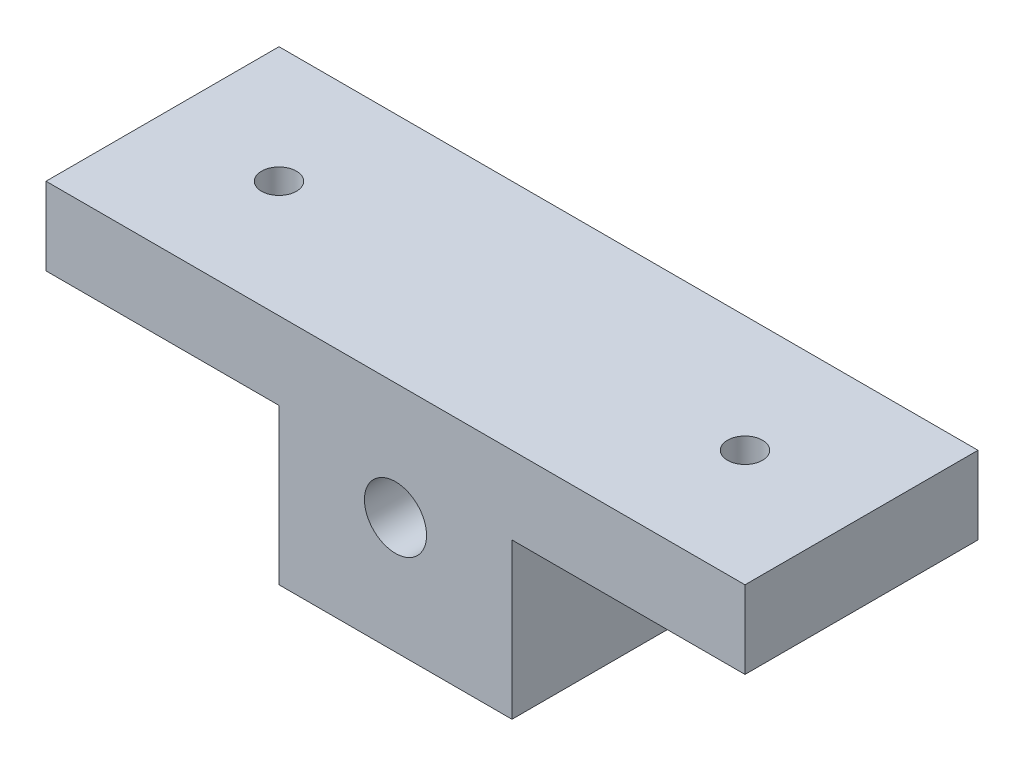
ISO-10303-21;
HEADER;
FILE_DESCRIPTION(('STEP AP214'),'2;1');
FILE_NAME('part.step','',(''),(''),'','','');
FILE_SCHEMA(('AUTOMOTIVE_DESIGN { 1 0 10303 214 1 1 1 1 }'));
ENDSEC;
DATA;
#1=APPLICATION_CONTEXT('core data for automotive mechanical design processes');
#2=APPLICATION_PROTOCOL_DEFINITION('international standard','automotive_design',2000,#1);
#3=PRODUCT_CONTEXT('',#1,'mechanical');
#4=PRODUCT('Part','Part','',(#3));
#5=PRODUCT_RELATED_PRODUCT_CATEGORY('part','',(#4));
#6=PRODUCT_DEFINITION_FORMATION('','',#4);
#7=PRODUCT_DEFINITION_CONTEXT('part definition',#1,'design');
#8=PRODUCT_DEFINITION('design','',#6,#7);
#9=PRODUCT_DEFINITION_SHAPE('','',#8);
#10=(LENGTH_UNIT() NAMED_UNIT(*) SI_UNIT(.MILLI.,.METRE.));
#11=(NAMED_UNIT(*) PLANE_ANGLE_UNIT() SI_UNIT($,.RADIAN.));
#12=(NAMED_UNIT(*) SI_UNIT($,.STERADIAN.) SOLID_ANGLE_UNIT());
#13=UNCERTAINTY_MEASURE_WITH_UNIT(LENGTH_MEASURE(1.E-05),#10,'distance_accuracy_value','');
#14=(GEOMETRIC_REPRESENTATION_CONTEXT(3) GLOBAL_UNCERTAINTY_ASSIGNED_CONTEXT((#13)) GLOBAL_UNIT_ASSIGNED_CONTEXT((#10,
#11,#12)) REPRESENTATION_CONTEXT('',''));
#15=CARTESIAN_POINT('',(0.,0.,0.));
#16=DIRECTION('',(0.,0.,1.));
#17=DIRECTION('',(1.,0.,0.));
#18=AXIS2_PLACEMENT_3D('',#15,#16,#17);
#19=CARTESIAN_POINT('',(-15.,15.,30.));
#20=DIRECTION('',(1.,0.,0.));
#21=DIRECTION('',(0.,1.,0.));
#22=AXIS2_PLACEMENT_3D('',#19,#20,#21);
#23=PLANE('',#22);
#24=DIRECTION('',(0.,0.,1.));
#25=VECTOR('',#24,1.);
#26=CARTESIAN_POINT('',(-15.,5.,0.));
#27=LINE('',#26,#25);
#28=CARTESIAN_POINT('',(-15.,5.,0.));
#29=VERTEX_POINT('',#28);
#30=CARTESIAN_POINT('',(-15.,5.,30.));
#31=VERTEX_POINT('',#30);
#32=EDGE_CURVE('E59',#29,#31,#27,.T.);
#33=ORIENTED_EDGE('',*,*,#32,.F.);
#34=DIRECTION('',(0.,-1.,0.));
#35=VECTOR('',#34,1.);
#36=CARTESIAN_POINT('',(-15.,15.,0.));
#37=LINE('',#36,#35);
#38=CARTESIAN_POINT('',(-15.,-15.,0.));
#39=VERTEX_POINT('',#38);
#40=EDGE_CURVE('E135',#29,#39,#37,.T.);
#41=ORIENTED_EDGE('',*,*,#40,.T.);
#42=DIRECTION('',(0.,0.,-1.));
#43=VECTOR('',#42,1.);
#44=CARTESIAN_POINT('',(-15.,-15.,30.));
#45=LINE('',#44,#43);
#46=CARTESIAN_POINT('',(-15.,-15.,30.));
#47=VERTEX_POINT('',#46);
#48=EDGE_CURVE('E11',#47,#39,#45,.T.);
#49=ORIENTED_EDGE('',*,*,#48,.F.);
#50=DIRECTION('',(0.,-1.,0.));
#51=VECTOR('',#50,1.);
#52=CARTESIAN_POINT('',(-15.,15.,30.));
#53=LINE('',#52,#51);
#54=EDGE_CURVE('E183',#31,#47,#53,.T.);
#55=ORIENTED_EDGE('',*,*,#54,.F.);
#56=EDGE_LOOP('',(#33,#41,#49,#55));
#57=FACE_BOUND('',#56,.T.);
#58=ADVANCED_FACE('F43',(#57),#23,.F.);
#59=CARTESIAN_POINT('',(15.,15.,30.));
#60=DIRECTION('',(-1.,0.,0.));
#61=DIRECTION('',(0.,-1.,0.));
#62=AXIS2_PLACEMENT_3D('',#59,#60,#61);
#63=PLANE('',#62);
#64=DIRECTION('',(0.,0.,-1.));
#65=VECTOR('',#64,1.);
#66=CARTESIAN_POINT('',(15.,5.,30.));
#67=LINE('',#66,#65);
#68=CARTESIAN_POINT('',(15.,5.,30.));
#69=VERTEX_POINT('',#68);
#70=CARTESIAN_POINT('',(15.,5.,0.));
#71=VERTEX_POINT('',#70);
#72=EDGE_CURVE('E67',#69,#71,#67,.T.);
#73=ORIENTED_EDGE('',*,*,#72,.F.);
#74=DIRECTION('',(0.,1.,0.));
#75=VECTOR('',#74,1.);
#76=CARTESIAN_POINT('',(15.,15.,30.));
#77=LINE('',#76,#75);
#78=CARTESIAN_POINT('',(15.,-15.,30.));
#79=VERTEX_POINT('',#78);
#80=EDGE_CURVE('E176',#79,#69,#77,.T.);
#81=ORIENTED_EDGE('',*,*,#80,.F.);
#82=DIRECTION('',(0.,0.,-1.));
#83=VECTOR('',#82,1.);
#84=CARTESIAN_POINT('',(15.,-15.,30.));
#85=LINE('',#84,#83);
#86=CARTESIAN_POINT('',(15.,-15.,0.));
#87=VERTEX_POINT('',#86);
#88=EDGE_CURVE('E52',#79,#87,#85,.T.);
#89=ORIENTED_EDGE('',*,*,#88,.T.);
#90=DIRECTION('',(0.,1.,0.));
#91=VECTOR('',#90,1.);
#92=CARTESIAN_POINT('',(15.,15.,0.));
#93=LINE('',#92,#91);
#94=EDGE_CURVE('E172',#87,#71,#93,.T.);
#95=ORIENTED_EDGE('',*,*,#94,.T.);
#96=EDGE_LOOP('',(#73,#81,#89,#95));
#97=FACE_BOUND('',#96,.T.);
#98=ADVANCED_FACE('F45',(#97),#63,.F.);
#99=CARTESIAN_POINT('',(-15.,15.,30.));
#100=DIRECTION('',(0.,-1.,0.));
#101=DIRECTION('',(0.,0.,-1.));
#102=AXIS2_PLACEMENT_3D('',#99,#100,#101);
#103=PLANE('',#102);
#104=CARTESIAN_POINT('',(30.,15.,15.));
#105=DIRECTION('',(0.,-1.,0.));
#106=DIRECTION('',(0.,0.,-1.));
#107=AXIS2_PLACEMENT_3D('',#104,#105,#106);
#108=CIRCLE('',#107,2.25);
#109=CARTESIAN_POINT('',(30.,15.,12.75));
#110=VERTEX_POINT('',#109);
#111=EDGE_CURVE('E234',#110,#110,#108,.T.);
#112=ORIENTED_EDGE('',*,*,#111,.T.);
#113=EDGE_LOOP('',(#112));
#114=FACE_BOUND('',#113,.T.);
#115=CARTESIAN_POINT('',(-30.,15.,15.));
#116=DIRECTION('',(0.,-1.,0.));
#117=DIRECTION('',(0.,0.,-1.));
#118=AXIS2_PLACEMENT_3D('',#115,#116,#117);
#119=CIRCLE('',#118,2.25);
#120=CARTESIAN_POINT('',(-30.,15.,12.75));
#121=VERTEX_POINT('',#120);
#122=EDGE_CURVE('E213',#121,#121,#119,.T.);
#123=ORIENTED_EDGE('',*,*,#122,.T.);
#124=EDGE_LOOP('',(#123));
#125=FACE_BOUND('',#124,.T.);
#126=DIRECTION('',(-1.,0.,0.));
#127=VECTOR('',#126,1.);
#128=CARTESIAN_POINT('',(-15.,15.,0.));
#129=LINE('',#128,#127);
#130=CARTESIAN_POINT('',(45.,15.,0.));
#131=VERTEX_POINT('',#130);
#132=CARTESIAN_POINT('',(-45.,15.,0.));
#133=VERTEX_POINT('',#132);
#134=EDGE_CURVE('E191',#131,#133,#129,.T.);
#135=ORIENTED_EDGE('',*,*,#134,.T.);
#136=DIRECTION('',(0.,0.,-1.));
#137=VECTOR('',#136,1.);
#138=CARTESIAN_POINT('',(-45.,15.,0.));
#139=LINE('',#138,#137);
#140=CARTESIAN_POINT('',(-45.,15.,30.));
#141=VERTEX_POINT('',#140);
#142=EDGE_CURVE('E128',#141,#133,#139,.T.);
#143=ORIENTED_EDGE('',*,*,#142,.F.);
#144=DIRECTION('',(-1.,0.,0.));
#145=VECTOR('',#144,1.);
#146=CARTESIAN_POINT('',(-15.,15.,30.));
#147=LINE('',#146,#145);
#148=CARTESIAN_POINT('',(45.,15.,30.));
#149=VERTEX_POINT('',#148);
#150=EDGE_CURVE('E179',#149,#141,#147,.T.);
#151=ORIENTED_EDGE('',*,*,#150,.F.);
#152=DIRECTION('',(0.,0.,1.));
#153=VECTOR('',#152,1.);
#154=CARTESIAN_POINT('',(45.,15.,30.));
#155=LINE('',#154,#153);
#156=EDGE_CURVE('E155',#131,#149,#155,.T.);
#157=ORIENTED_EDGE('',*,*,#156,.F.);
#158=EDGE_LOOP('',(#135,#143,#151,#157));
#159=FACE_BOUND('',#158,.T.);
#160=ADVANCED_FACE('F270',(#114,#125,#159),#103,.F.);
#161=CARTESIAN_POINT('',(-15.,-15.,30.));
#162=DIRECTION('',(0.,1.,0.));
#163=DIRECTION('',(0.,0.,1.));
#164=AXIS2_PLACEMENT_3D('',#161,#162,#163);
#165=PLANE('',#164);
#166=DIRECTION('',(1.,0.,0.));
#167=VECTOR('',#166,1.);
#168=CARTESIAN_POINT('',(-15.,-15.,0.));
#169=LINE('',#168,#167);
#170=EDGE_CURVE('E180',#39,#87,#169,.T.);
#171=ORIENTED_EDGE('',*,*,#170,.T.);
#172=ORIENTED_EDGE('',*,*,#88,.F.);
#173=DIRECTION('',(1.,0.,0.));
#174=VECTOR('',#173,1.);
#175=CARTESIAN_POINT('',(-15.,-15.,30.));
#176=LINE('',#175,#174);
#177=EDGE_CURVE('E186',#47,#79,#176,.T.);
#178=ORIENTED_EDGE('',*,*,#177,.F.);
#179=ORIENTED_EDGE('',*,*,#48,.T.);
#180=EDGE_LOOP('',(#171,#172,#178,#179));
#181=FACE_BOUND('',#180,.T.);
#182=ADVANCED_FACE('F211',(#181),#165,.F.);
#183=CARTESIAN_POINT('',(0.,0.,30.));
#184=DIRECTION('',(0.,0.,1.));
#185=DIRECTION('',(1.,0.,0.));
#186=AXIS2_PLACEMENT_3D('',#183,#184,#185);
#187=PLANE('',#186);
#188=CARTESIAN_POINT('',(0.,0.,30.));
#189=DIRECTION('',(0.,0.,1.));
#190=DIRECTION('',(1.,0.,0.));
#191=AXIS2_PLACEMENT_3D('',#188,#189,#190);
#192=CIRCLE('',#191,4.);
#193=CARTESIAN_POINT('',(4.,0.,30.));
#194=VERTEX_POINT('',#193);
#195=EDGE_CURVE('E167',#194,#194,#192,.T.);
#196=ORIENTED_EDGE('',*,*,#195,.F.);
#197=EDGE_LOOP('',(#196));
#198=FACE_BOUND('',#197,.T.);
#199=ORIENTED_EDGE('',*,*,#80,.T.);
#200=DIRECTION('',(-1.,0.,0.));
#201=VECTOR('',#200,1.);
#202=CARTESIAN_POINT('',(45.,5.00000000000001,30.));
#203=LINE('',#202,#201);
#204=CARTESIAN_POINT('',(45.,5.00000000000001,30.));
#205=VERTEX_POINT('',#204);
#206=EDGE_CURVE('E163',#205,#69,#203,.T.);
#207=ORIENTED_EDGE('',*,*,#206,.F.);
#208=DIRECTION('',(0.,-1.,0.));
#209=VECTOR('',#208,1.);
#210=CARTESIAN_POINT('',(45.,15.,30.));
#211=LINE('',#210,#209);
#212=EDGE_CURVE('E140',#149,#205,#211,.T.);
#213=ORIENTED_EDGE('',*,*,#212,.F.);
#214=ORIENTED_EDGE('',*,*,#150,.T.);
#215=DIRECTION('',(0.,1.,0.));
#216=VECTOR('',#215,1.);
#217=CARTESIAN_POINT('',(-45.,15.,30.));
#218=LINE('',#217,#216);
#219=CARTESIAN_POINT('',(-45.,5.,30.));
#220=VERTEX_POINT('',#219);
#221=EDGE_CURVE('E121',#220,#141,#218,.T.);
#222=ORIENTED_EDGE('',*,*,#221,.F.);
#223=DIRECTION('',(1.,0.,0.));
#224=VECTOR('',#223,1.);
#225=CARTESIAN_POINT('',(-45.,5.,30.));
#226=LINE('',#225,#224);
#227=EDGE_CURVE('E116',#220,#31,#226,.T.);
#228=ORIENTED_EDGE('',*,*,#227,.T.);
#229=ORIENTED_EDGE('',*,*,#54,.T.);
#230=ORIENTED_EDGE('',*,*,#177,.T.);
#231=EDGE_LOOP('',(#199,#207,#213,#214,#222,#228,#229,#230));
#232=FACE_BOUND('',#231,.T.);
#233=ADVANCED_FACE('F209',(#198,#232),#187,.T.);
#234=CARTESIAN_POINT('',(0.,0.,0.));
#235=DIRECTION('',(0.,0.,1.));
#236=DIRECTION('',(1.,0.,0.));
#237=AXIS2_PLACEMENT_3D('',#234,#235,#236);
#238=PLANE('',#237);
#239=CARTESIAN_POINT('',(0.,0.,0.));
#240=DIRECTION('',(0.,0.,1.));
#241=DIRECTION('',(1.,0.,0.));
#242=AXIS2_PLACEMENT_3D('',#239,#240,#241);
#243=CIRCLE('',#242,4.);
#244=CARTESIAN_POINT('',(4.,0.,0.));
#245=VERTEX_POINT('',#244);
#246=EDGE_CURVE('E168',#245,#245,#243,.T.);
#247=ORIENTED_EDGE('',*,*,#246,.T.);
#248=EDGE_LOOP('',(#247));
#249=FACE_BOUND('',#248,.T.);
#250=ORIENTED_EDGE('',*,*,#94,.F.);
#251=ORIENTED_EDGE('',*,*,#170,.F.);
#252=ORIENTED_EDGE('',*,*,#40,.F.);
#253=DIRECTION('',(1.,0.,0.));
#254=VECTOR('',#253,1.);
#255=CARTESIAN_POINT('',(-45.,5.,0.));
#256=LINE('',#255,#254);
#257=CARTESIAN_POINT('',(-45.,5.,0.));
#258=VERTEX_POINT('',#257);
#259=EDGE_CURVE('E114',#258,#29,#256,.T.);
#260=ORIENTED_EDGE('',*,*,#259,.F.);
#261=DIRECTION('',(0.,-1.,0.));
#262=VECTOR('',#261,1.);
#263=CARTESIAN_POINT('',(-45.,15.,0.));
#264=LINE('',#263,#262);
#265=EDGE_CURVE('E122',#133,#258,#264,.T.);
#266=ORIENTED_EDGE('',*,*,#265,.F.);
#267=ORIENTED_EDGE('',*,*,#134,.F.);
#268=DIRECTION('',(0.,1.,0.));
#269=VECTOR('',#268,1.);
#270=CARTESIAN_POINT('',(45.,15.,0.));
#271=LINE('',#270,#269);
#272=CARTESIAN_POINT('',(45.,5.00000000000001,0.));
#273=VERTEX_POINT('',#272);
#274=EDGE_CURVE('E151',#273,#131,#271,.T.);
#275=ORIENTED_EDGE('',*,*,#274,.F.);
#276=DIRECTION('',(-1.,0.,0.));
#277=VECTOR('',#276,1.);
#278=CARTESIAN_POINT('',(45.,5.00000000000001,0.));
#279=LINE('',#278,#277);
#280=EDGE_CURVE('E158',#273,#71,#279,.T.);
#281=ORIENTED_EDGE('',*,*,#280,.T.);
#282=EDGE_LOOP('',(#250,#251,#252,#260,#266,#267,#275,#281));
#283=FACE_BOUND('',#282,.T.);
#284=ADVANCED_FACE('F133',(#249,#283),#238,.F.);
#285=CARTESIAN_POINT('',(0.,0.,0.));
#286=DIRECTION('',(0.,0.,1.));
#287=DIRECTION('',(1.,0.,0.));
#288=AXIS2_PLACEMENT_3D('',#285,#286,#287);
#289=CYLINDRICAL_SURFACE('',#288,4.);
#290=ORIENTED_EDGE('',*,*,#246,.F.);
#291=EDGE_LOOP('',(#290));
#292=FACE_BOUND('',#291,.T.);
#293=ORIENTED_EDGE('',*,*,#195,.T.);
#294=EDGE_LOOP('',(#293));
#295=FACE_BOUND('',#294,.T.);
#296=ADVANCED_FACE('F255',(#292,#295),#289,.F.);
#297=CARTESIAN_POINT('',(45.,5.00000000000001,30.));
#298=DIRECTION('',(0.,1.,0.));
#299=DIRECTION('',(-1.,0.,0.));
#300=AXIS2_PLACEMENT_3D('',#297,#298,#299);
#301=PLANE('',#300);
#302=CARTESIAN_POINT('',(30.,5.,15.));
#303=DIRECTION('',(0.,-1.,0.));
#304=DIRECTION('',(0.,0.,-1.));
#305=AXIS2_PLACEMENT_3D('',#302,#303,#304);
#306=CIRCLE('',#305,5.);
#307=CARTESIAN_POINT('',(30.,5.,10.));
#308=VERTEX_POINT('',#307);
#309=EDGE_CURVE('E246',#308,#308,#306,.T.);
#310=ORIENTED_EDGE('',*,*,#309,.F.);
#311=EDGE_LOOP('',(#310));
#312=FACE_BOUND('',#311,.T.);
#313=ORIENTED_EDGE('',*,*,#72,.T.);
#314=ORIENTED_EDGE('',*,*,#280,.F.);
#315=DIRECTION('',(0.,0.,-1.));
#316=VECTOR('',#315,1.);
#317=CARTESIAN_POINT('',(45.,5.00000000000001,30.));
#318=LINE('',#317,#316);
#319=EDGE_CURVE('E148',#205,#273,#318,.T.);
#320=ORIENTED_EDGE('',*,*,#319,.F.);
#321=ORIENTED_EDGE('',*,*,#206,.T.);
#322=EDGE_LOOP('',(#313,#314,#320,#321));
#323=FACE_BOUND('',#322,.T.);
#324=ADVANCED_FACE('F205',(#312,#323),#301,.F.);
#325=CARTESIAN_POINT('',(45.,0.,0.));
#326=DIRECTION('',(1.,0.,0.));
#327=DIRECTION('',(0.,1.,0.));
#328=AXIS2_PLACEMENT_3D('',#325,#326,#327);
#329=PLANE('',#328);
#330=ORIENTED_EDGE('',*,*,#212,.T.);
#331=ORIENTED_EDGE('',*,*,#319,.T.);
#332=ORIENTED_EDGE('',*,*,#274,.T.);
#333=ORIENTED_EDGE('',*,*,#156,.T.);
#334=EDGE_LOOP('',(#330,#331,#332,#333));
#335=FACE_BOUND('',#334,.T.);
#336=ADVANCED_FACE('F254',(#335),#329,.T.);
#337=CARTESIAN_POINT('',(-45.,5.,0.));
#338=DIRECTION('',(0.,1.,0.));
#339=DIRECTION('',(-1.,0.,0.));
#340=AXIS2_PLACEMENT_3D('',#337,#338,#339);
#341=PLANE('',#340);
#342=CARTESIAN_POINT('',(-30.,4.99999999999999,15.));
#343=DIRECTION('',(0.,-1.,0.));
#344=DIRECTION('',(0.,0.,-1.));
#345=AXIS2_PLACEMENT_3D('',#342,#343,#344);
#346=CIRCLE('',#345,5.);
#347=CARTESIAN_POINT('',(-30.,4.99999999999999,10.));
#348=VERTEX_POINT('',#347);
#349=EDGE_CURVE('E230',#348,#348,#346,.T.);
#350=ORIENTED_EDGE('',*,*,#349,.F.);
#351=EDGE_LOOP('',(#350));
#352=FACE_BOUND('',#351,.T.);
#353=ORIENTED_EDGE('',*,*,#32,.T.);
#354=ORIENTED_EDGE('',*,*,#227,.F.);
#355=DIRECTION('',(0.,0.,1.));
#356=VECTOR('',#355,1.);
#357=CARTESIAN_POINT('',(-45.,5.,0.));
#358=LINE('',#357,#356);
#359=EDGE_CURVE('E110',#258,#220,#358,.T.);
#360=ORIENTED_EDGE('',*,*,#359,.F.);
#361=ORIENTED_EDGE('',*,*,#259,.T.);
#362=EDGE_LOOP('',(#353,#354,#360,#361));
#363=FACE_BOUND('',#362,.T.);
#364=ADVANCED_FACE('F112',(#352,#363),#341,.F.);
#365=CARTESIAN_POINT('',(-45.,0.,0.));
#366=DIRECTION('',(-1.,0.,0.));
#367=DIRECTION('',(0.,-1.,0.));
#368=AXIS2_PLACEMENT_3D('',#365,#366,#367);
#369=PLANE('',#368);
#370=ORIENTED_EDGE('',*,*,#265,.T.);
#371=ORIENTED_EDGE('',*,*,#359,.T.);
#372=ORIENTED_EDGE('',*,*,#221,.T.);
#373=ORIENTED_EDGE('',*,*,#142,.T.);
#374=EDGE_LOOP('',(#370,#371,#372,#373));
#375=FACE_BOUND('',#374,.T.);
#376=ADVANCED_FACE('F126',(#375),#369,.T.);
#377=CARTESIAN_POINT('',(-30.,4.99999999999999,15.));
#378=DIRECTION('',(0.,-1.,0.));
#379=DIRECTION('',(0.,0.,-1.));
#380=AXIS2_PLACEMENT_3D('',#377,#378,#379);
#381=CYLINDRICAL_SURFACE('',#380,2.25);
#382=ORIENTED_EDGE('',*,*,#122,.F.);
#383=EDGE_LOOP('',(#382));
#384=FACE_BOUND('',#383,.T.);
#385=CARTESIAN_POINT('',(-30.,8.99999999999999,15.));
#386=DIRECTION('',(0.,-1.,0.));
#387=DIRECTION('',(0.,0.,-1.));
#388=AXIS2_PLACEMENT_3D('',#385,#386,#387);
#389=CIRCLE('',#388,2.25);
#390=CARTESIAN_POINT('',(-30.,8.99999999999999,12.75));
#391=VERTEX_POINT('',#390);
#392=EDGE_CURVE('E222',#391,#391,#389,.T.);
#393=ORIENTED_EDGE('',*,*,#392,.T.);
#394=EDGE_LOOP('',(#393));
#395=FACE_BOUND('',#394,.T.);
#396=ADVANCED_FACE('F284',(#384,#395),#381,.F.);
#397=CARTESIAN_POINT('',(-27.75,8.99999999999999,15.));
#398=DIRECTION('',(0.,1.,0.));
#399=DIRECTION('',(0.,0.,1.));
#400=AXIS2_PLACEMENT_3D('',#397,#398,#399);
#401=PLANE('',#400);
#402=ORIENTED_EDGE('',*,*,#392,.F.);
#403=EDGE_LOOP('',(#402));
#404=FACE_BOUND('',#403,.T.);
#405=CARTESIAN_POINT('',(-30.,8.99999999999999,15.));
#406=DIRECTION('',(0.,-1.,0.));
#407=DIRECTION('',(0.,0.,-1.));
#408=AXIS2_PLACEMENT_3D('',#405,#406,#407);
#409=CIRCLE('',#408,5.);
#410=CARTESIAN_POINT('',(-30.,8.99999999999999,10.));
#411=VERTEX_POINT('',#410);
#412=EDGE_CURVE('E226',#411,#411,#409,.T.);
#413=ORIENTED_EDGE('',*,*,#412,.T.);
#414=EDGE_LOOP('',(#413));
#415=FACE_BOUND('',#414,.T.);
#416=ADVANCED_FACE('F287',(#404,#415),#401,.F.);
#417=CARTESIAN_POINT('',(-30.,4.99999999999999,15.));
#418=DIRECTION('',(0.,-1.,0.));
#419=DIRECTION('',(0.,0.,-1.));
#420=AXIS2_PLACEMENT_3D('',#417,#418,#419);
#421=CYLINDRICAL_SURFACE('',#420,5.);
#422=ORIENTED_EDGE('',*,*,#412,.F.);
#423=EDGE_LOOP('',(#422));
#424=FACE_BOUND('',#423,.T.);
#425=ORIENTED_EDGE('',*,*,#349,.T.);
#426=EDGE_LOOP('',(#425));
#427=FACE_BOUND('',#426,.T.);
#428=ADVANCED_FACE('F293',(#424,#427),#421,.F.);
#429=CARTESIAN_POINT('',(30.,5.,15.));
#430=DIRECTION('',(0.,-1.,0.));
#431=DIRECTION('',(0.,0.,-1.));
#432=AXIS2_PLACEMENT_3D('',#429,#430,#431);
#433=CYLINDRICAL_SURFACE('',#432,2.25);
#434=ORIENTED_EDGE('',*,*,#111,.F.);
#435=EDGE_LOOP('',(#434));
#436=FACE_BOUND('',#435,.T.);
#437=CARTESIAN_POINT('',(30.,9.,15.));
#438=DIRECTION('',(0.,-1.,0.));
#439=DIRECTION('',(0.,0.,-1.));
#440=AXIS2_PLACEMENT_3D('',#437,#438,#439);
#441=CIRCLE('',#440,2.25);
#442=CARTESIAN_POINT('',(30.,9.,12.75));
#443=VERTEX_POINT('',#442);
#444=EDGE_CURVE('E238',#443,#443,#441,.T.);
#445=ORIENTED_EDGE('',*,*,#444,.T.);
#446=EDGE_LOOP('',(#445));
#447=FACE_BOUND('',#446,.T.);
#448=ADVANCED_FACE('F299',(#436,#447),#433,.F.);
#449=CARTESIAN_POINT('',(32.25,9.,15.));
#450=DIRECTION('',(0.,1.,0.));
#451=DIRECTION('',(0.,0.,1.));
#452=AXIS2_PLACEMENT_3D('',#449,#450,#451);
#453=PLANE('',#452);
#454=ORIENTED_EDGE('',*,*,#444,.F.);
#455=EDGE_LOOP('',(#454));
#456=FACE_BOUND('',#455,.T.);
#457=CARTESIAN_POINT('',(30.,9.,15.));
#458=DIRECTION('',(0.,-1.,0.));
#459=DIRECTION('',(0.,0.,-1.));
#460=AXIS2_PLACEMENT_3D('',#457,#458,#459);
#461=CIRCLE('',#460,5.);
#462=CARTESIAN_POINT('',(30.,9.,10.));
#463=VERTEX_POINT('',#462);
#464=EDGE_CURVE('E242',#463,#463,#461,.T.);
#465=ORIENTED_EDGE('',*,*,#464,.T.);
#466=EDGE_LOOP('',(#465));
#467=FACE_BOUND('',#466,.T.);
#468=ADVANCED_FACE('F312',(#456,#467),#453,.F.);
#469=CARTESIAN_POINT('',(30.,5.,15.));
#470=DIRECTION('',(0.,-1.,0.));
#471=DIRECTION('',(0.,0.,-1.));
#472=AXIS2_PLACEMENT_3D('',#469,#470,#471);
#473=CYLINDRICAL_SURFACE('',#472,5.);
#474=ORIENTED_EDGE('',*,*,#464,.F.);
#475=EDGE_LOOP('',(#474));
#476=FACE_BOUND('',#475,.T.);
#477=ORIENTED_EDGE('',*,*,#309,.T.);
#478=EDGE_LOOP('',(#477));
#479=FACE_BOUND('',#478,.T.);
#480=ADVANCED_FACE('F251',(#476,#479),#473,.F.);
#481=CLOSED_SHELL('',(#58,#98,#160,#182,#233,#284,#296,#324,#336,#364,#376,#396,#416,#428,#448,
#468,#480));
#482=MANIFOLD_SOLID_BREP('B2',#481);
#483=ADVANCED_BREP_SHAPE_REPRESENTATION('',(#18,#482),#14);
#484=SHAPE_DEFINITION_REPRESENTATION(#9,#483);
ENDSEC;
END-ISO-10303-21;
